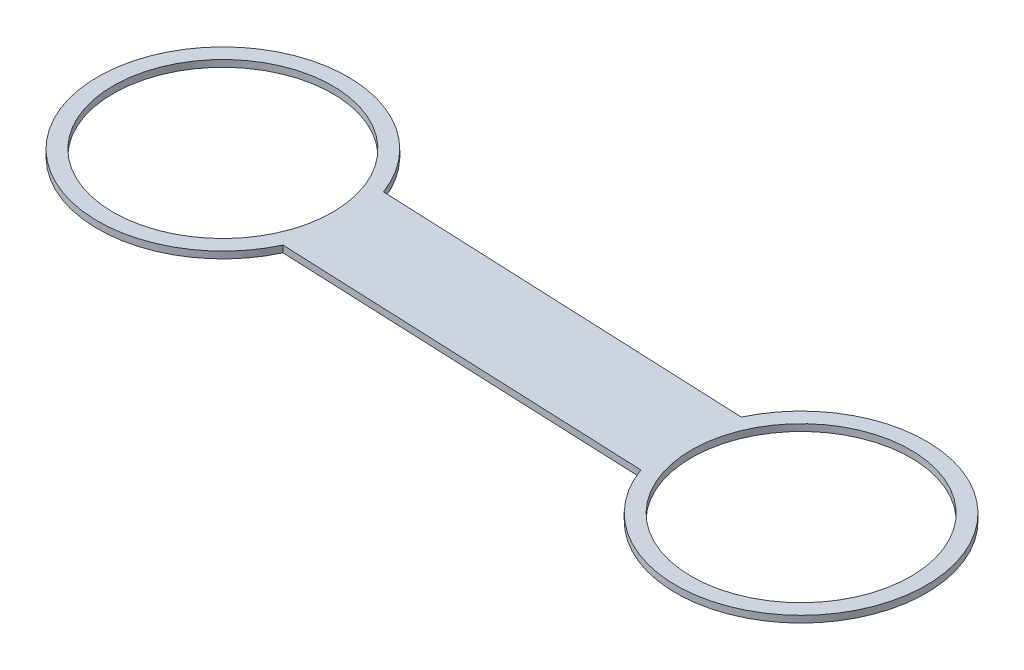
ISO-10303-21;
HEADER;
FILE_DESCRIPTION(('STEP AP214'),'2;1');
FILE_NAME('part.step','',(''),(''),'','','');
FILE_SCHEMA(('AUTOMOTIVE_DESIGN { 1 0 10303 214 1 1 1 1 }'));
ENDSEC;
DATA;
#1=APPLICATION_CONTEXT('core data for automotive mechanical design processes');
#2=APPLICATION_PROTOCOL_DEFINITION('international standard','automotive_design',2000,#1);
#3=PRODUCT_CONTEXT('',#1,'mechanical');
#4=PRODUCT('Part','Part','',(#3));
#5=PRODUCT_RELATED_PRODUCT_CATEGORY('part','',(#4));
#6=PRODUCT_DEFINITION_FORMATION('','',#4);
#7=PRODUCT_DEFINITION_CONTEXT('part definition',#1,'design');
#8=PRODUCT_DEFINITION('design','',#6,#7);
#9=PRODUCT_DEFINITION_SHAPE('','',#8);
#10=(LENGTH_UNIT() NAMED_UNIT(*) SI_UNIT(.MILLI.,.METRE.));
#11=(NAMED_UNIT(*) PLANE_ANGLE_UNIT() SI_UNIT($,.RADIAN.));
#12=(NAMED_UNIT(*) SI_UNIT($,.STERADIAN.) SOLID_ANGLE_UNIT());
#13=UNCERTAINTY_MEASURE_WITH_UNIT(LENGTH_MEASURE(1.E-05),#10,'distance_accuracy_value','');
#14=(GEOMETRIC_REPRESENTATION_CONTEXT(3) GLOBAL_UNCERTAINTY_ASSIGNED_CONTEXT((#13)) GLOBAL_UNIT_ASSIGNED_CONTEXT((#10,
#11,#12)) REPRESENTATION_CONTEXT('',''));
#15=CARTESIAN_POINT('',(0.,0.,0.));
#16=DIRECTION('',(0.,0.,1.));
#17=DIRECTION('',(1.,0.,0.));
#18=AXIS2_PLACEMENT_3D('',#15,#16,#17);
#19=CARTESIAN_POINT('',(178.811009985878,2.,7.77208167310776));
#20=DIRECTION('',(0.,1.,0.));
#21=DIRECTION('',(0.,0.,1.));
#22=AXIS2_PLACEMENT_3D('',#19,#20,#21);
#23=PLANE('',#22);
#24=CARTESIAN_POINT('',(0.,2.,0.));
#25=DIRECTION('',(0.,1.,0.));
#26=DIRECTION('',(0.,0.,1.));
#27=AXIS2_PLACEMENT_3D('',#24,#25,#26);
#28=CIRCLE('',#27,32.4358);
#29=CARTESIAN_POINT('',(0.,2.,32.4358));
#30=VERTEX_POINT('',#29);
#31=EDGE_CURVE('E100',#30,#30,#28,.T.);
#32=ORIENTED_EDGE('',*,*,#31,.F.);
#33=EDGE_LOOP('',(#32));
#34=FACE_BOUND('',#33,.T.);
#35=CARTESIAN_POINT('',(178.811009985878,2.,7.77208167310776));
#36=DIRECTION('',(0.,1.,0.));
#37=DIRECTION('',(0.,0.,1.));
#38=AXIS2_PLACEMENT_3D('',#35,#36,#37);
#39=CIRCLE('',#38,37.);
#40=CARTESIAN_POINT('',(144.033066177761,2.,20.4011997927322));
#41=VERTEX_POINT('',#40);
#42=CARTESIAN_POINT('',(145.341023246645,2.,-8.00004524990167));
#43=VERTEX_POINT('',#42);
#44=EDGE_CURVE('E85',#41,#43,#39,.T.);
#45=ORIENTED_EDGE('',*,*,#44,.T.);
#46=DIRECTION('',(-0.999069440720653,0.,-0.0431306459274788));
#47=VECTOR('',#46,1.);
#48=CARTESIAN_POINT('',(34.7244553413585,2.,-12.7754530740009));
#49=LINE('',#48,#47);
#50=CARTESIAN_POINT('',(34.7244553413585,2.,-12.7754530740009));
#51=VERTEX_POINT('',#50);
#52=EDGE_CURVE('E80',#43,#51,#49,.T.);
#53=ORIENTED_EDGE('',*,*,#52,.T.);
#54=CARTESIAN_POINT('',(0.,2.,0.));
#55=DIRECTION('',(0.,1.,0.));
#56=DIRECTION('',(0.,0.,1.));
#57=AXIS2_PLACEMENT_3D('',#54,#55,#56);
#58=CIRCLE('',#57,37.);
#59=CARTESIAN_POINT('',(33.4954140569429,2.,15.7180544964684));
#60=VERTEX_POINT('',#59);
#61=EDGE_CURVE('E83',#51,#60,#58,.T.);
#62=ORIENTED_EDGE('',*,*,#61,.T.);
#63=DIRECTION('',(0.99910372636415,0.,0.042328996743008));
#64=VECTOR('',#63,1.);
#65=CARTESIAN_POINT('',(33.4954140569429,2.,15.7180544964684));
#66=LINE('',#65,#64);
#67=EDGE_CURVE('E50',#60,#41,#66,.T.);
#68=ORIENTED_EDGE('',*,*,#67,.T.);
#69=EDGE_LOOP('',(#45,#53,#62,#68));
#70=FACE_BOUND('',#69,.T.);
#71=CARTESIAN_POINT('',(178.811009985878,2.,7.77208167310776));
#72=DIRECTION('',(0.,1.,0.));
#73=DIRECTION('',(0.,0.,1.));
#74=AXIS2_PLACEMENT_3D('',#71,#72,#73);
#75=CIRCLE('',#74,32.4358);
#76=CARTESIAN_POINT('',(178.811009985878,2.,40.2078816731078));
#77=VERTEX_POINT('',#76);
#78=EDGE_CURVE('E115',#77,#77,#75,.T.);
#79=ORIENTED_EDGE('',*,*,#78,.F.);
#80=EDGE_LOOP('',(#79));
#81=FACE_BOUND('',#80,.T.);
#82=ADVANCED_FACE('F33',(#34,#70,#81),#23,.T.);
#83=CARTESIAN_POINT('',(178.811009985878,0.,7.77208167310776));
#84=DIRECTION('',(0.,1.,0.));
#85=DIRECTION('',(0.,0.,1.));
#86=AXIS2_PLACEMENT_3D('',#83,#84,#85);
#87=PLANE('',#86);
#88=CARTESIAN_POINT('',(178.811009985878,0.,7.77208167310776));
#89=DIRECTION('',(0.,1.,0.));
#90=DIRECTION('',(0.,0.,1.));
#91=AXIS2_PLACEMENT_3D('',#88,#89,#90);
#92=CIRCLE('',#91,37.);
#93=CARTESIAN_POINT('',(144.033066177761,0.,20.4011997927322));
#94=VERTEX_POINT('',#93);
#95=CARTESIAN_POINT('',(145.341023246645,0.,-8.00004524990167));
#96=VERTEX_POINT('',#95);
#97=EDGE_CURVE('E97',#94,#96,#92,.T.);
#98=ORIENTED_EDGE('',*,*,#97,.F.);
#99=DIRECTION('',(0.99910372636415,0.,0.042328996743008));
#100=VECTOR('',#99,1.);
#101=CARTESIAN_POINT('',(33.4954140569429,0.,15.7180544964684));
#102=LINE('',#101,#100);
#103=CARTESIAN_POINT('',(33.4954140569429,0.,15.7180544964684));
#104=VERTEX_POINT('',#103);
#105=EDGE_CURVE('E73',#104,#94,#102,.T.);
#106=ORIENTED_EDGE('',*,*,#105,.F.);
#107=CARTESIAN_POINT('',(0.,0.,0.));
#108=DIRECTION('',(0.,1.,0.));
#109=DIRECTION('',(0.,0.,1.));
#110=AXIS2_PLACEMENT_3D('',#107,#108,#109);
#111=CIRCLE('',#110,37.);
#112=CARTESIAN_POINT('',(34.7244553413585,0.,-12.7754530740009));
#113=VERTEX_POINT('',#112);
#114=EDGE_CURVE('E67',#113,#104,#111,.T.);
#115=ORIENTED_EDGE('',*,*,#114,.F.);
#116=DIRECTION('',(-0.999069440720653,0.,-0.0431306459274788));
#117=VECTOR('',#116,1.);
#118=CARTESIAN_POINT('',(34.7244553413585,0.,-12.7754530740009));
#119=LINE('',#118,#117);
#120=EDGE_CURVE('E89',#96,#113,#119,.T.);
#121=ORIENTED_EDGE('',*,*,#120,.F.);
#122=EDGE_LOOP('',(#98,#106,#115,#121));
#123=FACE_BOUND('',#122,.T.);
#124=CARTESIAN_POINT('',(0.,0.,0.));
#125=DIRECTION('',(0.,1.,0.));
#126=DIRECTION('',(0.,0.,1.));
#127=AXIS2_PLACEMENT_3D('',#124,#125,#126);
#128=CIRCLE('',#127,32.4358);
#129=CARTESIAN_POINT('',(0.,0.,32.4358));
#130=VERTEX_POINT('',#129);
#131=EDGE_CURVE('E112',#130,#130,#128,.T.);
#132=ORIENTED_EDGE('',*,*,#131,.T.);
#133=EDGE_LOOP('',(#132));
#134=FACE_BOUND('',#133,.T.);
#135=CARTESIAN_POINT('',(178.811009985878,0.,7.77208167310776));
#136=DIRECTION('',(0.,1.,0.));
#137=DIRECTION('',(0.,0.,1.));
#138=AXIS2_PLACEMENT_3D('',#135,#136,#137);
#139=CIRCLE('',#138,32.4358);
#140=CARTESIAN_POINT('',(178.811009985878,0.,40.2078816731078));
#141=VERTEX_POINT('',#140);
#142=EDGE_CURVE('E118',#141,#141,#139,.T.);
#143=ORIENTED_EDGE('',*,*,#142,.T.);
#144=EDGE_LOOP('',(#143));
#145=FACE_BOUND('',#144,.T.);
#146=ADVANCED_FACE('F108',(#123,#134,#145),#87,.F.);
#147=CARTESIAN_POINT('',(178.811009985878,2.,7.77208167310776));
#148=DIRECTION('',(0.,-1.,0.));
#149=DIRECTION('',(0.,0.,-1.));
#150=AXIS2_PLACEMENT_3D('',#147,#148,#149);
#151=CYLINDRICAL_SURFACE('',#150,37.);
#152=ORIENTED_EDGE('',*,*,#97,.T.);
#153=DIRECTION('',(0.,-1.,0.));
#154=VECTOR('',#153,1.);
#155=CARTESIAN_POINT('',(145.341023246645,2.,-8.00004524990167));
#156=LINE('',#155,#154);
#157=EDGE_CURVE('E11',#43,#96,#156,.T.);
#158=ORIENTED_EDGE('',*,*,#157,.F.);
#159=ORIENTED_EDGE('',*,*,#44,.F.);
#160=DIRECTION('',(0.,-1.,0.));
#161=VECTOR('',#160,1.);
#162=CARTESIAN_POINT('',(144.033066177761,2.,20.4011997927322));
#163=LINE('',#162,#161);
#164=EDGE_CURVE('E93',#41,#94,#163,.T.);
#165=ORIENTED_EDGE('',*,*,#164,.T.);
#166=EDGE_LOOP('',(#152,#158,#159,#165));
#167=FACE_BOUND('',#166,.T.);
#168=ADVANCED_FACE('F35',(#167),#151,.T.);
#169=CARTESIAN_POINT('',(34.7244553413585,2.,-12.7754530740009));
#170=DIRECTION('',(-0.0431306459274788,0.,0.999069440720653));
#171=DIRECTION('',(0.999069440720653,0.,0.0431306459274788));
#172=AXIS2_PLACEMENT_3D('',#169,#170,#171);
#173=PLANE('',#172);
#174=ORIENTED_EDGE('',*,*,#120,.T.);
#175=DIRECTION('',(0.,-1.,0.));
#176=VECTOR('',#175,1.);
#177=CARTESIAN_POINT('',(34.7244553413585,2.,-12.7754530740009));
#178=LINE('',#177,#176);
#179=EDGE_CURVE('E42',#51,#113,#178,.T.);
#180=ORIENTED_EDGE('',*,*,#179,.F.);
#181=ORIENTED_EDGE('',*,*,#52,.F.);
#182=ORIENTED_EDGE('',*,*,#157,.T.);
#183=EDGE_LOOP('',(#174,#180,#181,#182));
#184=FACE_BOUND('',#183,.T.);
#185=ADVANCED_FACE('F88',(#184),#173,.F.);
#186=CARTESIAN_POINT('',(0.,2.,0.));
#187=DIRECTION('',(0.,-1.,0.));
#188=DIRECTION('',(0.,0.,-1.));
#189=AXIS2_PLACEMENT_3D('',#186,#187,#188);
#190=CYLINDRICAL_SURFACE('',#189,37.);
#191=ORIENTED_EDGE('',*,*,#114,.T.);
#192=DIRECTION('',(0.,-1.,0.));
#193=VECTOR('',#192,1.);
#194=CARTESIAN_POINT('',(33.4954140569429,2.,15.7180544964684));
#195=LINE('',#194,#193);
#196=EDGE_CURVE('E90',#60,#104,#195,.T.);
#197=ORIENTED_EDGE('',*,*,#196,.F.);
#198=ORIENTED_EDGE('',*,*,#61,.F.);
#199=ORIENTED_EDGE('',*,*,#179,.T.);
#200=EDGE_LOOP('',(#191,#197,#198,#199));
#201=FACE_BOUND('',#200,.T.);
#202=ADVANCED_FACE('F91',(#201),#190,.T.);
#203=CARTESIAN_POINT('',(33.4954140569429,2.,15.7180544964684));
#204=DIRECTION('',(0.042328996743008,0.,-0.99910372636415));
#205=DIRECTION('',(-0.99910372636415,0.,-0.042328996743008));
#206=AXIS2_PLACEMENT_3D('',#203,#204,#205);
#207=PLANE('',#206);
#208=ORIENTED_EDGE('',*,*,#105,.T.);
#209=ORIENTED_EDGE('',*,*,#164,.F.);
#210=ORIENTED_EDGE('',*,*,#67,.F.);
#211=ORIENTED_EDGE('',*,*,#196,.T.);
#212=EDGE_LOOP('',(#208,#209,#210,#211));
#213=FACE_BOUND('',#212,.T.);
#214=ADVANCED_FACE('F105',(#213),#207,.F.);
#215=CARTESIAN_POINT('',(0.,2.,0.));
#216=DIRECTION('',(0.,-1.,0.));
#217=DIRECTION('',(0.,0.,-1.));
#218=AXIS2_PLACEMENT_3D('',#215,#216,#217);
#219=CYLINDRICAL_SURFACE('',#218,32.4358);
#220=ORIENTED_EDGE('',*,*,#31,.T.);
#221=EDGE_LOOP('',(#220));
#222=FACE_BOUND('',#221,.T.);
#223=ORIENTED_EDGE('',*,*,#131,.F.);
#224=EDGE_LOOP('',(#223));
#225=FACE_BOUND('',#224,.T.);
#226=ADVANCED_FACE('F135',(#222,#225),#219,.F.);
#227=CARTESIAN_POINT('',(178.811009985878,2.,7.77208167310776));
#228=DIRECTION('',(0.,-1.,0.));
#229=DIRECTION('',(0.,0.,-1.));
#230=AXIS2_PLACEMENT_3D('',#227,#228,#229);
#231=CYLINDRICAL_SURFACE('',#230,32.4358);
#232=ORIENTED_EDGE('',*,*,#78,.T.);
#233=EDGE_LOOP('',(#232));
#234=FACE_BOUND('',#233,.T.);
#235=ORIENTED_EDGE('',*,*,#142,.F.);
#236=EDGE_LOOP('',(#235));
#237=FACE_BOUND('',#236,.T.);
#238=ADVANCED_FACE('F124',(#234,#237),#231,.F.);
#239=CLOSED_SHELL('',(#82,#146,#168,#185,#202,#214,#226,#238));
#240=MANIFOLD_SOLID_BREP('B2',#239);
#241=ADVANCED_BREP_SHAPE_REPRESENTATION('',(#18,#240),#14);
#242=SHAPE_DEFINITION_REPRESENTATION(#9,#241);
ENDSEC;
END-ISO-10303-21;
